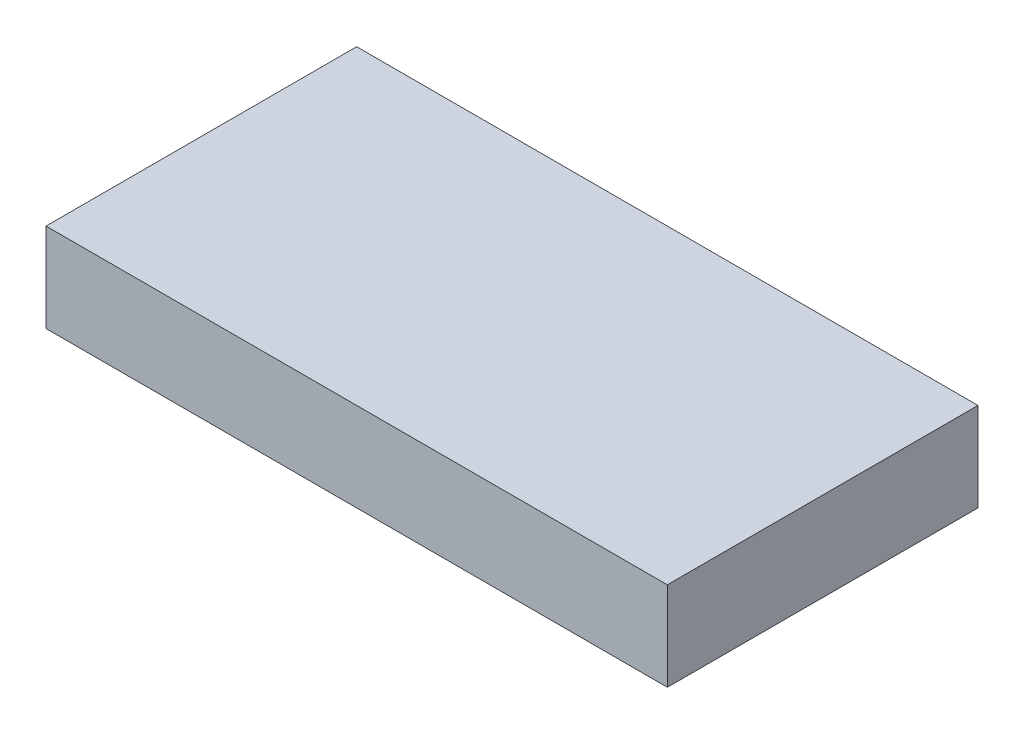
ISO-10303-21;
HEADER;
FILE_DESCRIPTION(('STEP AP214'),'2;1');
FILE_NAME('part.step','',(''),(''),'','','');
FILE_SCHEMA(('AUTOMOTIVE_DESIGN { 1 0 10303 214 1 1 1 1 }'));
ENDSEC;
DATA;
#1=APPLICATION_CONTEXT('core data for automotive mechanical design processes');
#2=APPLICATION_PROTOCOL_DEFINITION('international standard','automotive_design',2000,#1);
#3=PRODUCT_CONTEXT('',#1,'mechanical');
#4=PRODUCT('Part','Part','',(#3));
#5=PRODUCT_RELATED_PRODUCT_CATEGORY('part','',(#4));
#6=PRODUCT_DEFINITION_FORMATION('','',#4);
#7=PRODUCT_DEFINITION_CONTEXT('part definition',#1,'design');
#8=PRODUCT_DEFINITION('design','',#6,#7);
#9=PRODUCT_DEFINITION_SHAPE('','',#8);
#10=(LENGTH_UNIT() NAMED_UNIT(*) SI_UNIT(.MILLI.,.METRE.));
#11=(NAMED_UNIT(*) PLANE_ANGLE_UNIT() SI_UNIT($,.RADIAN.));
#12=(NAMED_UNIT(*) SI_UNIT($,.STERADIAN.) SOLID_ANGLE_UNIT());
#13=UNCERTAINTY_MEASURE_WITH_UNIT(LENGTH_MEASURE(1.E-05),#10,'distance_accuracy_value','');
#14=(GEOMETRIC_REPRESENTATION_CONTEXT(3) GLOBAL_UNCERTAINTY_ASSIGNED_CONTEXT((#13)) GLOBAL_UNIT_ASSIGNED_CONTEXT((#10,
#11,#12)) REPRESENTATION_CONTEXT('',''));
#15=CARTESIAN_POINT('',(0.,0.,0.));
#16=DIRECTION('',(0.,0.,1.));
#17=DIRECTION('',(1.,0.,0.));
#18=AXIS2_PLACEMENT_3D('',#15,#16,#17);
#19=CARTESIAN_POINT('',(-88.9,25.4,44.45));
#20=DIRECTION('',(-1.,0.,0.));
#21=DIRECTION('',(0.,0.,1.));
#22=AXIS2_PLACEMENT_3D('',#19,#20,#21);
#23=PLANE('',#22);
#24=DIRECTION('',(0.,0.,-1.));
#25=VECTOR('',#24,1.);
#26=CARTESIAN_POINT('',(-88.9,0.,44.45));
#27=LINE('',#26,#25);
#28=CARTESIAN_POINT('',(-88.9,0.,44.45));
#29=VERTEX_POINT('',#28);
#30=CARTESIAN_POINT('',(-88.9,0.,-44.45));
#31=VERTEX_POINT('',#30);
#32=EDGE_CURVE('E98',#29,#31,#27,.T.);
#33=ORIENTED_EDGE('',*,*,#32,.F.);
#34=DIRECTION('',(0.,-1.,0.));
#35=VECTOR('',#34,1.);
#36=CARTESIAN_POINT('',(-88.9,25.4,44.45));
#37=LINE('',#36,#35);
#38=CARTESIAN_POINT('',(-88.9,25.4,44.45));
#39=VERTEX_POINT('',#38);
#40=EDGE_CURVE('E11',#39,#29,#37,.T.);
#41=ORIENTED_EDGE('',*,*,#40,.F.);
#42=DIRECTION('',(0.,0.,-1.));
#43=VECTOR('',#42,1.);
#44=CARTESIAN_POINT('',(-88.9,25.4,44.45));
#45=LINE('',#44,#43);
#46=CARTESIAN_POINT('',(-88.9,25.4,-44.45));
#47=VERTEX_POINT('',#46);
#48=EDGE_CURVE('E93',#39,#47,#45,.T.);
#49=ORIENTED_EDGE('',*,*,#48,.T.);
#50=DIRECTION('',(0.,-1.,0.));
#51=VECTOR('',#50,1.);
#52=CARTESIAN_POINT('',(-88.9,25.4,-44.45));
#53=LINE('',#52,#51);
#54=EDGE_CURVE('E36',#47,#31,#53,.T.);
#55=ORIENTED_EDGE('',*,*,#54,.T.);
#56=EDGE_LOOP('',(#33,#41,#49,#55));
#57=FACE_BOUND('',#56,.T.);
#58=ADVANCED_FACE('F33',(#57),#23,.T.);
#59=CARTESIAN_POINT('',(-88.9,25.4,44.45));
#60=DIRECTION('',(0.,0.,-1.));
#61=DIRECTION('',(-1.,0.,0.));
#62=AXIS2_PLACEMENT_3D('',#59,#60,#61);
#63=PLANE('',#62);
#64=DIRECTION('',(1.,0.,0.));
#65=VECTOR('',#64,1.);
#66=CARTESIAN_POINT('',(-88.9,0.,44.45));
#67=LINE('',#66,#65);
#68=CARTESIAN_POINT('',(88.9,0.,44.45));
#69=VERTEX_POINT('',#68);
#70=EDGE_CURVE('E66',#29,#69,#67,.T.);
#71=ORIENTED_EDGE('',*,*,#70,.T.);
#72=DIRECTION('',(0.,-1.,0.));
#73=VECTOR('',#72,1.);
#74=CARTESIAN_POINT('',(88.9,25.4,44.45));
#75=LINE('',#74,#73);
#76=CARTESIAN_POINT('',(88.9,25.4,44.45));
#77=VERTEX_POINT('',#76);
#78=EDGE_CURVE('E42',#77,#69,#75,.T.);
#79=ORIENTED_EDGE('',*,*,#78,.F.);
#80=DIRECTION('',(1.,0.,0.));
#81=VECTOR('',#80,1.);
#82=CARTESIAN_POINT('',(-88.9,25.4,44.45));
#83=LINE('',#82,#81);
#84=EDGE_CURVE('E83',#39,#77,#83,.T.);
#85=ORIENTED_EDGE('',*,*,#84,.F.);
#86=ORIENTED_EDGE('',*,*,#40,.T.);
#87=EDGE_LOOP('',(#71,#79,#85,#86));
#88=FACE_BOUND('',#87,.T.);
#89=ADVANCED_FACE('F108',(#88),#63,.F.);
#90=CARTESIAN_POINT('',(88.9,25.4,44.45));
#91=DIRECTION('',(-1.,0.,0.));
#92=DIRECTION('',(0.,0.,1.));
#93=AXIS2_PLACEMENT_3D('',#90,#91,#92);
#94=PLANE('',#93);
#95=DIRECTION('',(0.,0.,-1.));
#96=VECTOR('',#95,1.);
#97=CARTESIAN_POINT('',(88.9,0.,44.45));
#98=LINE('',#97,#96);
#99=CARTESIAN_POINT('',(88.9,0.,-44.45));
#100=VERTEX_POINT('',#99);
#101=EDGE_CURVE('E90',#69,#100,#98,.T.);
#102=ORIENTED_EDGE('',*,*,#101,.T.);
#103=DIRECTION('',(0.,-1.,0.));
#104=VECTOR('',#103,1.);
#105=CARTESIAN_POINT('',(88.9,25.4,-44.45));
#106=LINE('',#105,#104);
#107=CARTESIAN_POINT('',(88.9,25.4,-44.45));
#108=VERTEX_POINT('',#107);
#109=EDGE_CURVE('E87',#108,#100,#106,.T.);
#110=ORIENTED_EDGE('',*,*,#109,.F.);
#111=DIRECTION('',(0.,0.,-1.));
#112=VECTOR('',#111,1.);
#113=CARTESIAN_POINT('',(88.9,25.4,44.45));
#114=LINE('',#113,#112);
#115=EDGE_CURVE('E78',#77,#108,#114,.T.);
#116=ORIENTED_EDGE('',*,*,#115,.F.);
#117=ORIENTED_EDGE('',*,*,#78,.T.);
#118=EDGE_LOOP('',(#102,#110,#116,#117));
#119=FACE_BOUND('',#118,.T.);
#120=ADVANCED_FACE('F88',(#119),#94,.F.);
#121=CARTESIAN_POINT('',(-88.9,25.4,-44.45));
#122=DIRECTION('',(0.,0.,-1.));
#123=DIRECTION('',(-1.,0.,0.));
#124=AXIS2_PLACEMENT_3D('',#121,#122,#123);
#125=PLANE('',#124);
#126=DIRECTION('',(1.,0.,0.));
#127=VECTOR('',#126,1.);
#128=CARTESIAN_POINT('',(-88.9,0.,-44.45));
#129=LINE('',#128,#127);
#130=EDGE_CURVE('E101',#31,#100,#129,.T.);
#131=ORIENTED_EDGE('',*,*,#130,.F.);
#132=ORIENTED_EDGE('',*,*,#54,.F.);
#133=DIRECTION('',(1.,0.,0.));
#134=VECTOR('',#133,1.);
#135=CARTESIAN_POINT('',(-88.9,25.4,-44.45));
#136=LINE('',#135,#134);
#137=EDGE_CURVE('E82',#47,#108,#136,.T.);
#138=ORIENTED_EDGE('',*,*,#137,.T.);
#139=ORIENTED_EDGE('',*,*,#109,.T.);
#140=EDGE_LOOP('',(#131,#132,#138,#139));
#141=FACE_BOUND('',#140,.T.);
#142=ADVANCED_FACE('F92',(#141),#125,.T.);
#143=CARTESIAN_POINT('',(0.,25.4,0.));
#144=DIRECTION('',(0.,-1.,0.));
#145=DIRECTION('',(0.,0.,-1.));
#146=AXIS2_PLACEMENT_3D('',#143,#144,#145);
#147=PLANE('',#146);
#148=ORIENTED_EDGE('',*,*,#48,.F.);
#149=ORIENTED_EDGE('',*,*,#84,.T.);
#150=ORIENTED_EDGE('',*,*,#115,.T.);
#151=ORIENTED_EDGE('',*,*,#137,.F.);
#152=EDGE_LOOP('',(#148,#149,#150,#151));
#153=FACE_BOUND('',#152,.T.);
#154=ADVANCED_FACE('F81',(#153),#147,.F.);
#155=CARTESIAN_POINT('',(0.,0.,0.));
#156=DIRECTION('',(0.,-1.,0.));
#157=DIRECTION('',(0.,0.,-1.));
#158=AXIS2_PLACEMENT_3D('',#155,#156,#157);
#159=PLANE('',#158);
#160=ORIENTED_EDGE('',*,*,#32,.T.);
#161=ORIENTED_EDGE('',*,*,#130,.T.);
#162=ORIENTED_EDGE('',*,*,#101,.F.);
#163=ORIENTED_EDGE('',*,*,#70,.F.);
#164=EDGE_LOOP('',(#160,#161,#162,#163));
#165=FACE_BOUND('',#164,.T.);
#166=ADVANCED_FACE('F106',(#165),#159,.T.);
#167=CLOSED_SHELL('',(#58,#89,#120,#142,#154,#166));
#168=MANIFOLD_SOLID_BREP('B2',#167);
#169=ADVANCED_BREP_SHAPE_REPRESENTATION('',(#18,#168),#14);
#170=SHAPE_DEFINITION_REPRESENTATION(#9,#169);
ENDSEC;
END-ISO-10303-21;
